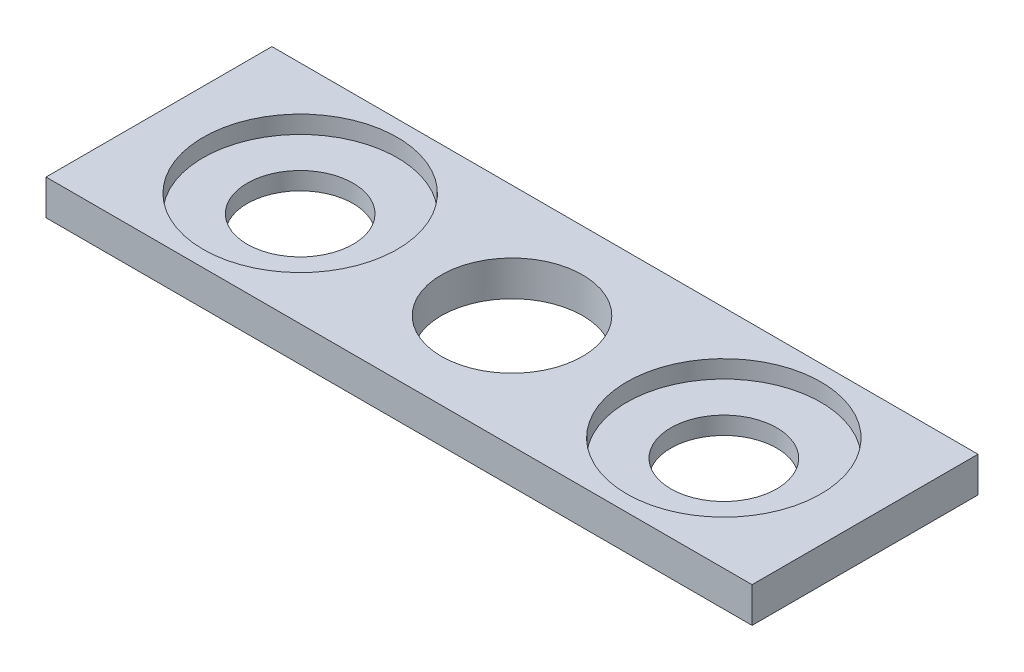
ISO-10303-21;
HEADER;
FILE_DESCRIPTION(('STEP AP214'),'2;1');
FILE_NAME('part.step','',(''),(''),'','','');
FILE_SCHEMA(('AUTOMOTIVE_DESIGN { 1 0 10303 214 1 1 1 1 }'));
ENDSEC;
DATA;
#1=APPLICATION_CONTEXT('core data for automotive mechanical design processes');
#2=APPLICATION_PROTOCOL_DEFINITION('international standard','automotive_design',2000,#1);
#3=PRODUCT_CONTEXT('',#1,'mechanical');
#4=PRODUCT('Part','Part','',(#3));
#5=PRODUCT_RELATED_PRODUCT_CATEGORY('part','',(#4));
#6=PRODUCT_DEFINITION_FORMATION('','',#4);
#7=PRODUCT_DEFINITION_CONTEXT('part definition',#1,'design');
#8=PRODUCT_DEFINITION('design','',#6,#7);
#9=PRODUCT_DEFINITION_SHAPE('','',#8);
#10=(LENGTH_UNIT() NAMED_UNIT(*) SI_UNIT(.MILLI.,.METRE.));
#11=(NAMED_UNIT(*) PLANE_ANGLE_UNIT() SI_UNIT($,.RADIAN.));
#12=(NAMED_UNIT(*) SI_UNIT($,.STERADIAN.) SOLID_ANGLE_UNIT());
#13=UNCERTAINTY_MEASURE_WITH_UNIT(LENGTH_MEASURE(1.E-05),#10,'distance_accuracy_value','');
#14=(GEOMETRIC_REPRESENTATION_CONTEXT(3) GLOBAL_UNCERTAINTY_ASSIGNED_CONTEXT((#13)) GLOBAL_UNIT_ASSIGNED_CONTEXT((#10,
#11,#12)) REPRESENTATION_CONTEXT('',''));
#15=CARTESIAN_POINT('',(0.,0.,0.));
#16=DIRECTION('',(0.,0.,1.));
#17=DIRECTION('',(1.,0.,0.));
#18=AXIS2_PLACEMENT_3D('',#15,#16,#17);
#19=CARTESIAN_POINT('',(12.7,3.175,-10.16));
#20=DIRECTION('',(0.,-1.,0.));
#21=DIRECTION('',(0.,0.,-1.));
#22=AXIS2_PLACEMENT_3D('',#19,#20,#21);
#23=CYLINDRICAL_SURFACE('',#22,4.7625);
#24=CARTESIAN_POINT('',(12.7,0.,-10.16));
#25=DIRECTION('',(0.,1.,0.));
#26=DIRECTION('',(0.,0.,1.));
#27=AXIS2_PLACEMENT_3D('',#24,#25,#26);
#28=CIRCLE('',#27,4.7625);
#29=CARTESIAN_POINT('',(12.7,0.,-5.3975));
#30=VERTEX_POINT('',#29);
#31=EDGE_CURVE('E105',#30,#30,#28,.T.);
#32=ORIENTED_EDGE('',*,*,#31,.F.);
#33=EDGE_LOOP('',(#32));
#34=FACE_BOUND('',#33,.T.);
#35=CARTESIAN_POINT('',(12.7,1.5875,-10.16));
#36=DIRECTION('',(0.,1.,0.));
#37=DIRECTION('',(0.,0.,1.));
#38=AXIS2_PLACEMENT_3D('',#35,#36,#37);
#39=CIRCLE('',#38,4.7625);
#40=CARTESIAN_POINT('',(12.7,1.5875,-5.3975));
#41=VERTEX_POINT('',#40);
#42=EDGE_CURVE('E39',#41,#41,#39,.T.);
#43=ORIENTED_EDGE('',*,*,#42,.T.);
#44=EDGE_LOOP('',(#43));
#45=FACE_BOUND('',#44,.T.);
#46=ADVANCED_FACE('F35',(#34,#45),#23,.F.);
#47=CARTESIAN_POINT('',(50.8,3.175,-10.16));
#48=DIRECTION('',(0.,-1.,0.));
#49=DIRECTION('',(0.,0.,-1.));
#50=AXIS2_PLACEMENT_3D('',#47,#48,#49);
#51=CYLINDRICAL_SURFACE('',#50,4.7625);
#52=CARTESIAN_POINT('',(50.8,0.,-10.16));
#53=DIRECTION('',(0.,1.,0.));
#54=DIRECTION('',(0.,0.,1.));
#55=AXIS2_PLACEMENT_3D('',#52,#53,#54);
#56=CIRCLE('',#55,4.7625);
#57=CARTESIAN_POINT('',(50.8,0.,-5.3975));
#58=VERTEX_POINT('',#57);
#59=EDGE_CURVE('E113',#58,#58,#56,.T.);
#60=ORIENTED_EDGE('',*,*,#59,.F.);
#61=EDGE_LOOP('',(#60));
#62=FACE_BOUND('',#61,.T.);
#63=CARTESIAN_POINT('',(50.8,1.5875,-10.16));
#64=DIRECTION('',(0.,1.,0.));
#65=DIRECTION('',(0.,0.,1.));
#66=AXIS2_PLACEMENT_3D('',#63,#64,#65);
#67=CIRCLE('',#66,4.7625);
#68=CARTESIAN_POINT('',(50.8,1.5875,-5.3975));
#69=VERTEX_POINT('',#68);
#70=EDGE_CURVE('E115',#69,#69,#67,.T.);
#71=ORIENTED_EDGE('',*,*,#70,.T.);
#72=EDGE_LOOP('',(#71));
#73=FACE_BOUND('',#72,.T.);
#74=ADVANCED_FACE('F147',(#62,#73),#51,.F.);
#75=CARTESIAN_POINT('',(0.,3.175,0.));
#76=DIRECTION('',(0.,-1.,0.));
#77=DIRECTION('',(0.,0.,-1.));
#78=AXIS2_PLACEMENT_3D('',#75,#76,#77);
#79=PLANE('',#78);
#80=CARTESIAN_POINT('',(12.7,3.175,-10.16));
#81=DIRECTION('',(0.,1.,0.));
#82=DIRECTION('',(0.,0.,1.));
#83=AXIS2_PLACEMENT_3D('',#80,#81,#82);
#84=CIRCLE('',#83,8.73125);
#85=CARTESIAN_POINT('',(12.7,3.175,-1.42875));
#86=VERTEX_POINT('',#85);
#87=EDGE_CURVE('E122',#86,#86,#84,.T.);
#88=ORIENTED_EDGE('',*,*,#87,.F.);
#89=EDGE_LOOP('',(#88));
#90=FACE_BOUND('',#89,.T.);
#91=CARTESIAN_POINT('',(50.8,3.175,-10.16));
#92=DIRECTION('',(0.,1.,0.));
#93=DIRECTION('',(0.,0.,1.));
#94=AXIS2_PLACEMENT_3D('',#91,#92,#93);
#95=CIRCLE('',#94,8.73124999999999);
#96=CARTESIAN_POINT('',(50.8,3.175,-1.42875000000001));
#97=VERTEX_POINT('',#96);
#98=EDGE_CURVE('E132',#97,#97,#95,.T.);
#99=ORIENTED_EDGE('',*,*,#98,.F.);
#100=EDGE_LOOP('',(#99));
#101=FACE_BOUND('',#100,.T.);
#102=CARTESIAN_POINT('',(31.75,3.175,-10.16));
#103=DIRECTION('',(0.,1.,0.));
#104=DIRECTION('',(0.,0.,1.));
#105=AXIS2_PLACEMENT_3D('',#102,#103,#104);
#106=CIRCLE('',#105,6.35);
#107=CARTESIAN_POINT('',(31.75,3.175,-3.81));
#108=VERTEX_POINT('',#107);
#109=EDGE_CURVE('E114',#108,#108,#106,.T.);
#110=ORIENTED_EDGE('',*,*,#109,.F.);
#111=EDGE_LOOP('',(#110));
#112=FACE_BOUND('',#111,.T.);
#113=DIRECTION('',(0.,0.,1.));
#114=VECTOR('',#113,1.);
#115=CARTESIAN_POINT('',(0.,3.175,0.));
#116=LINE('',#115,#114);
#117=CARTESIAN_POINT('',(0.,3.175,-20.32));
#118=VERTEX_POINT('',#117);
#119=CARTESIAN_POINT('',(0.,3.175,0.));
#120=VERTEX_POINT('',#119);
#121=EDGE_CURVE('E89',#118,#120,#116,.T.);
#122=ORIENTED_EDGE('',*,*,#121,.T.);
#123=DIRECTION('',(1.,0.,0.));
#124=VECTOR('',#123,1.);
#125=CARTESIAN_POINT('',(0.,3.175,0.));
#126=LINE('',#125,#124);
#127=CARTESIAN_POINT('',(63.5,3.175,0.));
#128=VERTEX_POINT('',#127);
#129=EDGE_CURVE('E84',#120,#128,#126,.T.);
#130=ORIENTED_EDGE('',*,*,#129,.T.);
#131=DIRECTION('',(0.,0.,-1.));
#132=VECTOR('',#131,1.);
#133=CARTESIAN_POINT('',(63.5,3.175,0.));
#134=LINE('',#133,#132);
#135=CARTESIAN_POINT('',(63.5,3.175,-20.32));
#136=VERTEX_POINT('',#135);
#137=EDGE_CURVE('E87',#128,#136,#134,.T.);
#138=ORIENTED_EDGE('',*,*,#137,.T.);
#139=DIRECTION('',(-1.,0.,0.));
#140=VECTOR('',#139,1.);
#141=CARTESIAN_POINT('',(0.,3.175,-20.32));
#142=LINE('',#141,#140);
#143=EDGE_CURVE('E54',#136,#118,#142,.T.);
#144=ORIENTED_EDGE('',*,*,#143,.T.);
#145=EDGE_LOOP('',(#122,#130,#138,#144));
#146=FACE_BOUND('',#145,.T.);
#147=ADVANCED_FACE('F85',(#90,#101,#112,#146),#79,.F.);
#148=CARTESIAN_POINT('',(0.,0.,0.));
#149=DIRECTION('',(0.,-1.,0.));
#150=DIRECTION('',(0.,0.,-1.));
#151=AXIS2_PLACEMENT_3D('',#148,#149,#150);
#152=PLANE('',#151);
#153=CARTESIAN_POINT('',(31.75,0.,-10.16));
#154=DIRECTION('',(0.,-1.,0.));
#155=DIRECTION('',(0.,0.,-1.));
#156=AXIS2_PLACEMENT_3D('',#153,#154,#155);
#157=CIRCLE('',#156,6.35);
#158=CARTESIAN_POINT('',(31.75,0.,-16.51));
#159=VERTEX_POINT('',#158);
#160=EDGE_CURVE('E111',#159,#159,#157,.T.);
#161=ORIENTED_EDGE('',*,*,#160,.F.);
#162=EDGE_LOOP('',(#161));
#163=FACE_BOUND('',#162,.T.);
#164=ORIENTED_EDGE('',*,*,#31,.T.);
#165=EDGE_LOOP('',(#164));
#166=FACE_BOUND('',#165,.T.);
#167=DIRECTION('',(0.,0.,1.));
#168=VECTOR('',#167,1.);
#169=CARTESIAN_POINT('',(0.,0.,0.));
#170=LINE('',#169,#168);
#171=CARTESIAN_POINT('',(0.,0.,-20.32));
#172=VERTEX_POINT('',#171);
#173=CARTESIAN_POINT('',(0.,0.,0.));
#174=VERTEX_POINT('',#173);
#175=EDGE_CURVE('E102',#172,#174,#170,.T.);
#176=ORIENTED_EDGE('',*,*,#175,.F.);
#177=DIRECTION('',(-1.,0.,0.));
#178=VECTOR('',#177,1.);
#179=CARTESIAN_POINT('',(0.,0.,-20.32));
#180=LINE('',#179,#178);
#181=CARTESIAN_POINT('',(63.5,0.,-20.32));
#182=VERTEX_POINT('',#181);
#183=EDGE_CURVE('E77',#182,#172,#180,.T.);
#184=ORIENTED_EDGE('',*,*,#183,.F.);
#185=DIRECTION('',(0.,0.,-1.));
#186=VECTOR('',#185,1.);
#187=CARTESIAN_POINT('',(63.5,0.,0.));
#188=LINE('',#187,#186);
#189=CARTESIAN_POINT('',(63.5,0.,0.));
#190=VERTEX_POINT('',#189);
#191=EDGE_CURVE('E71',#190,#182,#188,.T.);
#192=ORIENTED_EDGE('',*,*,#191,.F.);
#193=DIRECTION('',(1.,0.,0.));
#194=VECTOR('',#193,1.);
#195=CARTESIAN_POINT('',(0.,0.,0.));
#196=LINE('',#195,#194);
#197=EDGE_CURVE('E93',#174,#190,#196,.T.);
#198=ORIENTED_EDGE('',*,*,#197,.F.);
#199=EDGE_LOOP('',(#176,#184,#192,#198));
#200=FACE_BOUND('',#199,.T.);
#201=ORIENTED_EDGE('',*,*,#59,.T.);
#202=EDGE_LOOP('',(#201));
#203=FACE_BOUND('',#202,.T.);
#204=ADVANCED_FACE('F142',(#163,#166,#200,#203),#152,.T.);
#205=CARTESIAN_POINT('',(0.,3.175,0.));
#206=DIRECTION('',(1.,0.,0.));
#207=DIRECTION('',(0.,0.,-1.));
#208=AXIS2_PLACEMENT_3D('',#205,#206,#207);
#209=PLANE('',#208);
#210=ORIENTED_EDGE('',*,*,#175,.T.);
#211=DIRECTION('',(0.,-1.,0.));
#212=VECTOR('',#211,1.);
#213=CARTESIAN_POINT('',(0.,3.175,0.));
#214=LINE('',#213,#212);
#215=EDGE_CURVE('E11',#120,#174,#214,.T.);
#216=ORIENTED_EDGE('',*,*,#215,.F.);
#217=ORIENTED_EDGE('',*,*,#121,.F.);
#218=DIRECTION('',(0.,-1.,0.));
#219=VECTOR('',#218,1.);
#220=CARTESIAN_POINT('',(0.,3.175,-20.32));
#221=LINE('',#220,#219);
#222=EDGE_CURVE('E98',#118,#172,#221,.T.);
#223=ORIENTED_EDGE('',*,*,#222,.T.);
#224=EDGE_LOOP('',(#210,#216,#217,#223));
#225=FACE_BOUND('',#224,.T.);
#226=ADVANCED_FACE('F37',(#225),#209,.F.);
#227=CARTESIAN_POINT('',(0.,3.175,0.));
#228=DIRECTION('',(0.,0.,-1.));
#229=DIRECTION('',(-1.,0.,0.));
#230=AXIS2_PLACEMENT_3D('',#227,#228,#229);
#231=PLANE('',#230);
#232=ORIENTED_EDGE('',*,*,#197,.T.);
#233=DIRECTION('',(0.,-1.,0.));
#234=VECTOR('',#233,1.);
#235=CARTESIAN_POINT('',(63.5,3.175,0.));
#236=LINE('',#235,#234);
#237=EDGE_CURVE('E45',#128,#190,#236,.T.);
#238=ORIENTED_EDGE('',*,*,#237,.F.);
#239=ORIENTED_EDGE('',*,*,#129,.F.);
#240=ORIENTED_EDGE('',*,*,#215,.T.);
#241=EDGE_LOOP('',(#232,#238,#239,#240));
#242=FACE_BOUND('',#241,.T.);
#243=ADVANCED_FACE('F92',(#242),#231,.F.);
#244=CARTESIAN_POINT('',(63.5,3.175,0.));
#245=DIRECTION('',(-1.,0.,0.));
#246=DIRECTION('',(0.,0.,1.));
#247=AXIS2_PLACEMENT_3D('',#244,#245,#246);
#248=PLANE('',#247);
#249=ORIENTED_EDGE('',*,*,#191,.T.);
#250=DIRECTION('',(0.,-1.,0.));
#251=VECTOR('',#250,1.);
#252=CARTESIAN_POINT('',(63.5,3.175,-20.32));
#253=LINE('',#252,#251);
#254=EDGE_CURVE('E94',#136,#182,#253,.T.);
#255=ORIENTED_EDGE('',*,*,#254,.F.);
#256=ORIENTED_EDGE('',*,*,#137,.F.);
#257=ORIENTED_EDGE('',*,*,#237,.T.);
#258=EDGE_LOOP('',(#249,#255,#256,#257));
#259=FACE_BOUND('',#258,.T.);
#260=ADVANCED_FACE('F96',(#259),#248,.F.);
#261=CARTESIAN_POINT('',(0.,3.175,-20.32));
#262=DIRECTION('',(0.,0.,1.));
#263=DIRECTION('',(1.,0.,0.));
#264=AXIS2_PLACEMENT_3D('',#261,#262,#263);
#265=PLANE('',#264);
#266=ORIENTED_EDGE('',*,*,#183,.T.);
#267=ORIENTED_EDGE('',*,*,#222,.F.);
#268=ORIENTED_EDGE('',*,*,#143,.F.);
#269=ORIENTED_EDGE('',*,*,#254,.T.);
#270=EDGE_LOOP('',(#266,#267,#268,#269));
#271=FACE_BOUND('',#270,.T.);
#272=ADVANCED_FACE('F172',(#271),#265,.F.);
#273=CARTESIAN_POINT('',(31.75,-3.175,-10.16));
#274=DIRECTION('',(0.,1.,0.));
#275=DIRECTION('',(0.,0.,1.));
#276=AXIS2_PLACEMENT_3D('',#273,#274,#275);
#277=CYLINDRICAL_SURFACE('',#276,6.35);
#278=ORIENTED_EDGE('',*,*,#160,.T.);
#279=EDGE_LOOP('',(#278));
#280=FACE_BOUND('',#279,.T.);
#281=ORIENTED_EDGE('',*,*,#109,.T.);
#282=EDGE_LOOP('',(#281));
#283=FACE_BOUND('',#282,.T.);
#284=ADVANCED_FACE('F168',(#280,#283),#277,.F.);
#285=CARTESIAN_POINT('',(50.8,1.5875,-10.16));
#286=DIRECTION('',(0.,1.,0.));
#287=DIRECTION('',(0.,0.,1.));
#288=AXIS2_PLACEMENT_3D('',#285,#286,#287);
#289=CYLINDRICAL_SURFACE('',#288,8.73124999999999);
#290=CARTESIAN_POINT('',(50.8,1.5875,-10.16));
#291=DIRECTION('',(0.,1.,0.));
#292=DIRECTION('',(0.,0.,1.));
#293=AXIS2_PLACEMENT_3D('',#290,#291,#292);
#294=CIRCLE('',#293,8.73124999999999);
#295=CARTESIAN_POINT('',(50.8,1.5875,-1.42875000000001));
#296=VERTEX_POINT('',#295);
#297=EDGE_CURVE('E127',#296,#296,#294,.T.);
#298=ORIENTED_EDGE('',*,*,#297,.F.);
#299=EDGE_LOOP('',(#298));
#300=FACE_BOUND('',#299,.T.);
#301=ORIENTED_EDGE('',*,*,#98,.T.);
#302=EDGE_LOOP('',(#301));
#303=FACE_BOUND('',#302,.T.);
#304=ADVANCED_FACE('F164',(#300,#303),#289,.F.);
#305=CARTESIAN_POINT('',(50.8,1.5875,-10.16));
#306=DIRECTION('',(0.,1.,0.));
#307=DIRECTION('',(0.,0.,1.));
#308=AXIS2_PLACEMENT_3D('',#305,#306,#307);
#309=PLANE('',#308);
#310=ORIENTED_EDGE('',*,*,#70,.F.);
#311=EDGE_LOOP('',(#310));
#312=FACE_BOUND('',#311,.T.);
#313=ORIENTED_EDGE('',*,*,#297,.T.);
#314=EDGE_LOOP('',(#313));
#315=FACE_BOUND('',#314,.T.);
#316=ADVANCED_FACE('F158',(#312,#315),#309,.T.);
#317=CARTESIAN_POINT('',(12.7,1.5875,-10.16));
#318=DIRECTION('',(0.,1.,0.));
#319=DIRECTION('',(0.,0.,1.));
#320=AXIS2_PLACEMENT_3D('',#317,#318,#319);
#321=CYLINDRICAL_SURFACE('',#320,8.73125);
#322=CARTESIAN_POINT('',(12.7,1.5875,-10.16));
#323=DIRECTION('',(0.,1.,0.));
#324=DIRECTION('',(0.,0.,1.));
#325=AXIS2_PLACEMENT_3D('',#322,#323,#324);
#326=CIRCLE('',#325,8.73125);
#327=CARTESIAN_POINT('',(12.7,1.5875,-1.42875));
#328=VERTEX_POINT('',#327);
#329=EDGE_CURVE('E117',#328,#328,#326,.T.);
#330=ORIENTED_EDGE('',*,*,#329,.F.);
#331=EDGE_LOOP('',(#330));
#332=FACE_BOUND('',#331,.T.);
#333=ORIENTED_EDGE('',*,*,#87,.T.);
#334=EDGE_LOOP('',(#333));
#335=FACE_BOUND('',#334,.T.);
#336=ADVANCED_FACE('F153',(#332,#335),#321,.F.);
#337=CARTESIAN_POINT('',(12.7,1.5875,-10.16));
#338=DIRECTION('',(0.,1.,0.));
#339=DIRECTION('',(0.,0.,1.));
#340=AXIS2_PLACEMENT_3D('',#337,#338,#339);
#341=PLANE('',#340);
#342=ORIENTED_EDGE('',*,*,#42,.F.);
#343=EDGE_LOOP('',(#342));
#344=FACE_BOUND('',#343,.T.);
#345=ORIENTED_EDGE('',*,*,#329,.T.);
#346=EDGE_LOOP('',(#345));
#347=FACE_BOUND('',#346,.T.);
#348=ADVANCED_FACE('F151',(#344,#347),#341,.T.);
#349=CLOSED_SHELL('',(#46,#74,#147,#204,#226,#243,#260,#272,#284,#304,#316,#336,#348));
#350=MANIFOLD_SOLID_BREP('B2',#349);
#351=ADVANCED_BREP_SHAPE_REPRESENTATION('',(#18,#350),#14);
#352=SHAPE_DEFINITION_REPRESENTATION(#9,#351);
ENDSEC;
END-ISO-10303-21;
